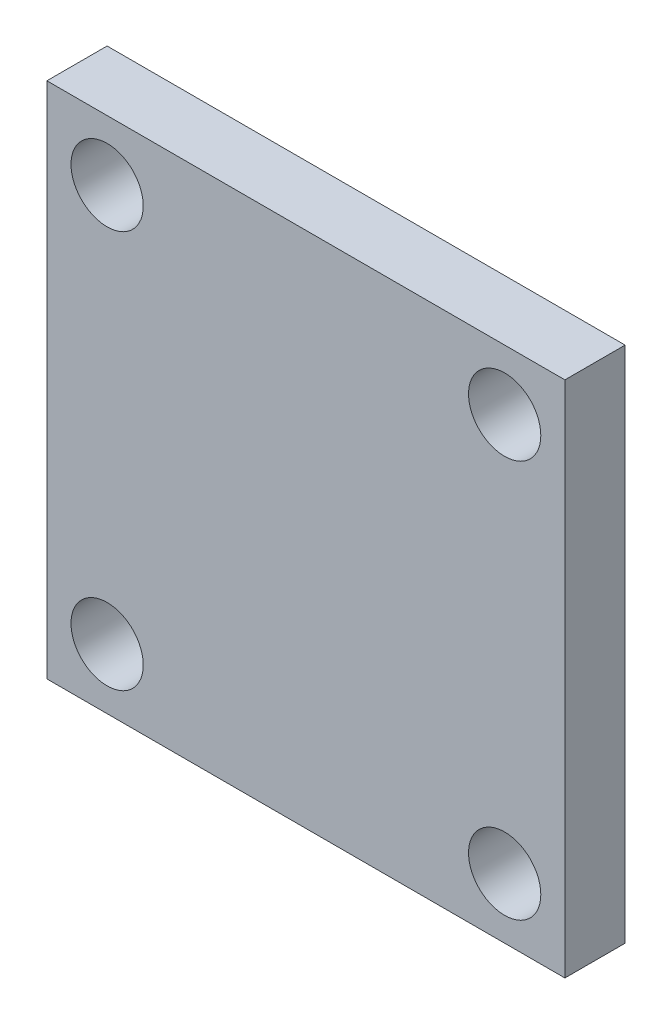
ISO-10303-21;
HEADER;
FILE_DESCRIPTION(('STEP AP214'),'2;1');
FILE_NAME('part.step','',(''),(''),'','','');
FILE_SCHEMA(('AUTOMOTIVE_DESIGN { 1 0 10303 214 1 1 1 1 }'));
ENDSEC;
DATA;
#1=APPLICATION_CONTEXT('core data for automotive mechanical design processes');
#2=APPLICATION_PROTOCOL_DEFINITION('international standard','automotive_design',2000,#1);
#3=PRODUCT_CONTEXT('',#1,'mechanical');
#4=PRODUCT('Part','Part','',(#3));
#5=PRODUCT_RELATED_PRODUCT_CATEGORY('part','',(#4));
#6=PRODUCT_DEFINITION_FORMATION('','',#4);
#7=PRODUCT_DEFINITION_CONTEXT('part definition',#1,'design');
#8=PRODUCT_DEFINITION('design','',#6,#7);
#9=PRODUCT_DEFINITION_SHAPE('','',#8);
#10=(LENGTH_UNIT() NAMED_UNIT(*) SI_UNIT(.MILLI.,.METRE.));
#11=(NAMED_UNIT(*) PLANE_ANGLE_UNIT() SI_UNIT($,.RADIAN.));
#12=(NAMED_UNIT(*) SI_UNIT($,.STERADIAN.) SOLID_ANGLE_UNIT());
#13=UNCERTAINTY_MEASURE_WITH_UNIT(LENGTH_MEASURE(1.E-05),#10,'distance_accuracy_value','');
#14=(GEOMETRIC_REPRESENTATION_CONTEXT(3) GLOBAL_UNCERTAINTY_ASSIGNED_CONTEXT((#13)) GLOBAL_UNIT_ASSIGNED_CONTEXT((#10,
#11,#12)) REPRESENTATION_CONTEXT('',''));
#15=CARTESIAN_POINT('',(0.,0.,0.));
#16=DIRECTION('',(0.,0.,1.));
#17=DIRECTION('',(1.,0.,0.));
#18=AXIS2_PLACEMENT_3D('',#15,#16,#17);
#19=CARTESIAN_POINT('',(0.,0.,5.));
#20=DIRECTION('',(0.,0.,1.));
#21=DIRECTION('',(1.,0.,0.));
#22=AXIS2_PLACEMENT_3D('',#19,#20,#21);
#23=PLANE('',#22);
#24=CARTESIAN_POINT('',(16.5000000000001,16.4999999999999,5.));
#25=DIRECTION('',(0.,0.,1.));
#26=DIRECTION('',(1.,0.,0.));
#27=AXIS2_PLACEMENT_3D('',#24,#25,#26);
#28=CIRCLE('',#27,3.);
#29=CARTESIAN_POINT('',(19.5000000000001,16.4999999999999,5.));
#30=VERTEX_POINT('',#29);
#31=EDGE_CURVE('E142',#30,#30,#28,.T.);
#32=ORIENTED_EDGE('',*,*,#31,.F.);
#33=EDGE_LOOP('',(#32));
#34=FACE_BOUND('',#33,.T.);
#35=CARTESIAN_POINT('',(-16.5,-16.5,5.));
#36=DIRECTION('',(0.,0.,1.));
#37=DIRECTION('',(1.,0.,0.));
#38=AXIS2_PLACEMENT_3D('',#35,#36,#37);
#39=CIRCLE('',#38,3.);
#40=CARTESIAN_POINT('',(-13.5,-16.5,5.));
#41=VERTEX_POINT('',#40);
#42=EDGE_CURVE('E112',#41,#41,#39,.T.);
#43=ORIENTED_EDGE('',*,*,#42,.F.);
#44=EDGE_LOOP('',(#43));
#45=FACE_BOUND('',#44,.T.);
#46=DIRECTION('',(0.,1.,0.));
#47=VECTOR('',#46,1.);
#48=CARTESIAN_POINT('',(21.5,21.5,5.));
#49=LINE('',#48,#47);
#50=CARTESIAN_POINT('',(21.5,-21.5,5.));
#51=VERTEX_POINT('',#50);
#52=CARTESIAN_POINT('',(21.5,21.5,5.));
#53=VERTEX_POINT('',#52);
#54=EDGE_CURVE('E92',#51,#53,#49,.T.);
#55=ORIENTED_EDGE('',*,*,#54,.T.);
#56=DIRECTION('',(-1.,0.,0.));
#57=VECTOR('',#56,1.);
#58=CARTESIAN_POINT('',(-21.5,21.5,5.));
#59=LINE('',#58,#57);
#60=CARTESIAN_POINT('',(-21.5,21.5,5.));
#61=VERTEX_POINT('',#60);
#62=EDGE_CURVE('E87',#53,#61,#59,.T.);
#63=ORIENTED_EDGE('',*,*,#62,.T.);
#64=DIRECTION('',(0.,-1.,0.));
#65=VECTOR('',#64,1.);
#66=CARTESIAN_POINT('',(-21.5,21.5,5.));
#67=LINE('',#66,#65);
#68=CARTESIAN_POINT('',(-21.5,-21.5,5.));
#69=VERTEX_POINT('',#68);
#70=EDGE_CURVE('E90',#61,#69,#67,.T.);
#71=ORIENTED_EDGE('',*,*,#70,.T.);
#72=DIRECTION('',(1.,0.,0.));
#73=VECTOR('',#72,1.);
#74=CARTESIAN_POINT('',(-21.5,-21.5,5.));
#75=LINE('',#74,#73);
#76=EDGE_CURVE('E57',#69,#51,#75,.T.);
#77=ORIENTED_EDGE('',*,*,#76,.T.);
#78=EDGE_LOOP('',(#55,#63,#71,#77));
#79=FACE_BOUND('',#78,.T.);
#80=CARTESIAN_POINT('',(-16.4999999999999,16.5000000000001,5.));
#81=DIRECTION('',(0.,0.,1.));
#82=DIRECTION('',(1.,0.,0.));
#83=AXIS2_PLACEMENT_3D('',#80,#81,#82);
#84=CIRCLE('',#83,3.);
#85=CARTESIAN_POINT('',(-13.4999999999999,16.5000000000001,5.));
#86=VERTEX_POINT('',#85);
#87=EDGE_CURVE('E134',#86,#86,#84,.T.);
#88=ORIENTED_EDGE('',*,*,#87,.F.);
#89=EDGE_LOOP('',(#88));
#90=FACE_BOUND('',#89,.T.);
#91=CARTESIAN_POINT('',(16.4999999999998,-16.5000000000002,5.));
#92=DIRECTION('',(0.,0.,1.));
#93=DIRECTION('',(1.,0.,0.));
#94=AXIS2_PLACEMENT_3D('',#91,#92,#93);
#95=CIRCLE('',#94,3.);
#96=CARTESIAN_POINT('',(19.4999999999998,-16.5000000000002,5.));
#97=VERTEX_POINT('',#96);
#98=EDGE_CURVE('E150',#97,#97,#95,.T.);
#99=ORIENTED_EDGE('',*,*,#98,.F.);
#100=EDGE_LOOP('',(#99));
#101=FACE_BOUND('',#100,.T.);
#102=ADVANCED_FACE('F39',(#34,#45,#79,#90,#101),#23,.T.);
#103=CARTESIAN_POINT('',(0.,0.,0.));
#104=DIRECTION('',(0.,0.,1.));
#105=DIRECTION('',(1.,0.,0.));
#106=AXIS2_PLACEMENT_3D('',#103,#104,#105);
#107=PLANE('',#106);
#108=DIRECTION('',(0.,1.,0.));
#109=VECTOR('',#108,1.);
#110=CARTESIAN_POINT('',(21.5,21.5,0.));
#111=LINE('',#110,#109);
#112=CARTESIAN_POINT('',(21.5,-21.5,0.));
#113=VERTEX_POINT('',#112);
#114=CARTESIAN_POINT('',(21.5,21.5,0.));
#115=VERTEX_POINT('',#114);
#116=EDGE_CURVE('E108',#113,#115,#111,.T.);
#117=ORIENTED_EDGE('',*,*,#116,.F.);
#118=DIRECTION('',(1.,0.,0.));
#119=VECTOR('',#118,1.);
#120=CARTESIAN_POINT('',(-21.5,-21.5,0.));
#121=LINE('',#120,#119);
#122=CARTESIAN_POINT('',(-21.5,-21.5,0.));
#123=VERTEX_POINT('',#122);
#124=EDGE_CURVE('E80',#123,#113,#121,.T.);
#125=ORIENTED_EDGE('',*,*,#124,.F.);
#126=DIRECTION('',(0.,-1.,0.));
#127=VECTOR('',#126,1.);
#128=CARTESIAN_POINT('',(-21.5,21.5,0.));
#129=LINE('',#128,#127);
#130=CARTESIAN_POINT('',(-21.5,21.5,0.));
#131=VERTEX_POINT('',#130);
#132=EDGE_CURVE('E74',#131,#123,#129,.T.);
#133=ORIENTED_EDGE('',*,*,#132,.F.);
#134=DIRECTION('',(-1.,0.,0.));
#135=VECTOR('',#134,1.);
#136=CARTESIAN_POINT('',(-21.5,21.5,0.));
#137=LINE('',#136,#135);
#138=EDGE_CURVE('E97',#115,#131,#137,.T.);
#139=ORIENTED_EDGE('',*,*,#138,.F.);
#140=EDGE_LOOP('',(#117,#125,#133,#139));
#141=FACE_BOUND('',#140,.T.);
#142=CARTESIAN_POINT('',(-16.5,-16.5,0.));
#143=DIRECTION('',(0.,0.,1.));
#144=DIRECTION('',(1.,0.,0.));
#145=AXIS2_PLACEMENT_3D('',#142,#143,#144);
#146=CIRCLE('',#145,3.);
#147=CARTESIAN_POINT('',(-13.5,-16.5,0.));
#148=VERTEX_POINT('',#147);
#149=EDGE_CURVE('E130',#148,#148,#146,.T.);
#150=ORIENTED_EDGE('',*,*,#149,.T.);
#151=EDGE_LOOP('',(#150));
#152=FACE_BOUND('',#151,.T.);
#153=CARTESIAN_POINT('',(-16.4999999999999,16.5000000000001,0.));
#154=DIRECTION('',(0.,0.,1.));
#155=DIRECTION('',(1.,0.,0.));
#156=AXIS2_PLACEMENT_3D('',#153,#154,#155);
#157=CIRCLE('',#156,3.);
#158=CARTESIAN_POINT('',(-13.4999999999999,16.5000000000001,0.));
#159=VERTEX_POINT('',#158);
#160=EDGE_CURVE('E138',#159,#159,#157,.T.);
#161=ORIENTED_EDGE('',*,*,#160,.T.);
#162=EDGE_LOOP('',(#161));
#163=FACE_BOUND('',#162,.T.);
#164=CARTESIAN_POINT('',(16.5000000000001,16.4999999999999,0.));
#165=DIRECTION('',(0.,0.,1.));
#166=DIRECTION('',(1.,0.,0.));
#167=AXIS2_PLACEMENT_3D('',#164,#165,#166);
#168=CIRCLE('',#167,3.);
#169=CARTESIAN_POINT('',(19.5000000000001,16.4999999999999,0.));
#170=VERTEX_POINT('',#169);
#171=EDGE_CURVE('E146',#170,#170,#168,.T.);
#172=ORIENTED_EDGE('',*,*,#171,.T.);
#173=EDGE_LOOP('',(#172));
#174=FACE_BOUND('',#173,.T.);
#175=CARTESIAN_POINT('',(16.4999999999998,-16.5000000000002,0.));
#176=DIRECTION('',(0.,0.,1.));
#177=DIRECTION('',(1.,0.,0.));
#178=AXIS2_PLACEMENT_3D('',#175,#176,#177);
#179=CIRCLE('',#178,3.);
#180=CARTESIAN_POINT('',(19.4999999999998,-16.5000000000002,0.));
#181=VERTEX_POINT('',#180);
#182=EDGE_CURVE('E154',#181,#181,#179,.T.);
#183=ORIENTED_EDGE('',*,*,#182,.T.);
#184=EDGE_LOOP('',(#183));
#185=FACE_BOUND('',#184,.T.);
#186=ADVANCED_FACE('F125',(#141,#152,#163,#174,#185),#107,.F.);
#187=CARTESIAN_POINT('',(21.5,21.5,5.));
#188=DIRECTION('',(-1.,0.,0.));
#189=DIRECTION('',(0.,-1.,0.));
#190=AXIS2_PLACEMENT_3D('',#187,#188,#189);
#191=PLANE('',#190);
#192=ORIENTED_EDGE('',*,*,#116,.T.);
#193=DIRECTION('',(0.,0.,-1.));
#194=VECTOR('',#193,1.);
#195=CARTESIAN_POINT('',(21.5,21.5,5.));
#196=LINE('',#195,#194);
#197=EDGE_CURVE('E11',#53,#115,#196,.T.);
#198=ORIENTED_EDGE('',*,*,#197,.F.);
#199=ORIENTED_EDGE('',*,*,#54,.F.);
#200=DIRECTION('',(0.,0.,-1.));
#201=VECTOR('',#200,1.);
#202=CARTESIAN_POINT('',(21.5,-21.5,5.));
#203=LINE('',#202,#201);
#204=EDGE_CURVE('E104',#51,#113,#203,.T.);
#205=ORIENTED_EDGE('',*,*,#204,.T.);
#206=EDGE_LOOP('',(#192,#198,#199,#205));
#207=FACE_BOUND('',#206,.T.);
#208=ADVANCED_FACE('F41',(#207),#191,.F.);
#209=CARTESIAN_POINT('',(-21.5,21.5,5.));
#210=DIRECTION('',(0.,-1.,0.));
#211=DIRECTION('',(0.,0.,-1.));
#212=AXIS2_PLACEMENT_3D('',#209,#210,#211);
#213=PLANE('',#212);
#214=ORIENTED_EDGE('',*,*,#138,.T.);
#215=DIRECTION('',(0.,0.,-1.));
#216=VECTOR('',#215,1.);
#217=CARTESIAN_POINT('',(-21.5,21.5,5.));
#218=LINE('',#217,#216);
#219=EDGE_CURVE('E49',#61,#131,#218,.T.);
#220=ORIENTED_EDGE('',*,*,#219,.F.);
#221=ORIENTED_EDGE('',*,*,#62,.F.);
#222=ORIENTED_EDGE('',*,*,#197,.T.);
#223=EDGE_LOOP('',(#214,#220,#221,#222));
#224=FACE_BOUND('',#223,.T.);
#225=ADVANCED_FACE('F96',(#224),#213,.F.);
#226=CARTESIAN_POINT('',(-21.5,21.5,5.));
#227=DIRECTION('',(1.,0.,0.));
#228=DIRECTION('',(0.,1.,0.));
#229=AXIS2_PLACEMENT_3D('',#226,#227,#228);
#230=PLANE('',#229);
#231=ORIENTED_EDGE('',*,*,#132,.T.);
#232=DIRECTION('',(0.,0.,-1.));
#233=VECTOR('',#232,1.);
#234=CARTESIAN_POINT('',(-21.5,-21.5,5.));
#235=LINE('',#234,#233);
#236=EDGE_CURVE('E99',#69,#123,#235,.T.);
#237=ORIENTED_EDGE('',*,*,#236,.F.);
#238=ORIENTED_EDGE('',*,*,#70,.F.);
#239=ORIENTED_EDGE('',*,*,#219,.T.);
#240=EDGE_LOOP('',(#231,#237,#238,#239));
#241=FACE_BOUND('',#240,.T.);
#242=ADVANCED_FACE('F100',(#241),#230,.F.);
#243=CARTESIAN_POINT('',(-21.5,-21.5,5.));
#244=DIRECTION('',(0.,1.,0.));
#245=DIRECTION('',(0.,0.,1.));
#246=AXIS2_PLACEMENT_3D('',#243,#244,#245);
#247=PLANE('',#246);
#248=ORIENTED_EDGE('',*,*,#124,.T.);
#249=ORIENTED_EDGE('',*,*,#204,.F.);
#250=ORIENTED_EDGE('',*,*,#76,.F.);
#251=ORIENTED_EDGE('',*,*,#236,.T.);
#252=EDGE_LOOP('',(#248,#249,#250,#251));
#253=FACE_BOUND('',#252,.T.);
#254=ADVANCED_FACE('F122',(#253),#247,.F.);
#255=CARTESIAN_POINT('',(-16.5,-16.5,5.));
#256=DIRECTION('',(0.,0.,-1.));
#257=DIRECTION('',(-1.,0.,0.));
#258=AXIS2_PLACEMENT_3D('',#255,#256,#257);
#259=CYLINDRICAL_SURFACE('',#258,3.);
#260=ORIENTED_EDGE('',*,*,#42,.T.);
#261=EDGE_LOOP('',(#260));
#262=FACE_BOUND('',#261,.T.);
#263=ORIENTED_EDGE('',*,*,#149,.F.);
#264=EDGE_LOOP('',(#263));
#265=FACE_BOUND('',#264,.T.);
#266=ADVANCED_FACE('F175',(#262,#265),#259,.F.);
#267=CARTESIAN_POINT('',(-16.4999999999999,16.5000000000001,5.));
#268=DIRECTION('',(0.,0.,-1.));
#269=DIRECTION('',(-1.,0.,0.));
#270=AXIS2_PLACEMENT_3D('',#267,#268,#269);
#271=CYLINDRICAL_SURFACE('',#270,3.);
#272=ORIENTED_EDGE('',*,*,#87,.T.);
#273=EDGE_LOOP('',(#272));
#274=FACE_BOUND('',#273,.T.);
#275=ORIENTED_EDGE('',*,*,#160,.F.);
#276=EDGE_LOOP('',(#275));
#277=FACE_BOUND('',#276,.T.);
#278=ADVANCED_FACE('F221',(#274,#277),#271,.F.);
#279=CARTESIAN_POINT('',(16.5000000000001,16.4999999999999,5.));
#280=DIRECTION('',(0.,0.,-1.));
#281=DIRECTION('',(-1.,0.,0.));
#282=AXIS2_PLACEMENT_3D('',#279,#280,#281);
#283=CYLINDRICAL_SURFACE('',#282,3.);
#284=ORIENTED_EDGE('',*,*,#31,.T.);
#285=EDGE_LOOP('',(#284));
#286=FACE_BOUND('',#285,.T.);
#287=ORIENTED_EDGE('',*,*,#171,.F.);
#288=EDGE_LOOP('',(#287));
#289=FACE_BOUND('',#288,.T.);
#290=ADVANCED_FACE('F229',(#286,#289),#283,.F.);
#291=CARTESIAN_POINT('',(16.4999999999998,-16.5000000000002,5.));
#292=DIRECTION('',(0.,0.,-1.));
#293=DIRECTION('',(-1.,0.,0.));
#294=AXIS2_PLACEMENT_3D('',#291,#292,#293);
#295=CYLINDRICAL_SURFACE('',#294,3.);
#296=ORIENTED_EDGE('',*,*,#98,.T.);
#297=EDGE_LOOP('',(#296));
#298=FACE_BOUND('',#297,.T.);
#299=ORIENTED_EDGE('',*,*,#182,.F.);
#300=EDGE_LOOP('',(#299));
#301=FACE_BOUND('',#300,.T.);
#302=ADVANCED_FACE('F162',(#298,#301),#295,.F.);
#303=CLOSED_SHELL('',(#102,#186,#208,#225,#242,#254,#266,#278,#290,#302));
#304=MANIFOLD_SOLID_BREP('B2',#303);
#305=ADVANCED_BREP_SHAPE_REPRESENTATION('',(#18,#304),#14);
#306=SHAPE_DEFINITION_REPRESENTATION(#9,#305);
ENDSEC;
END-ISO-10303-21;
